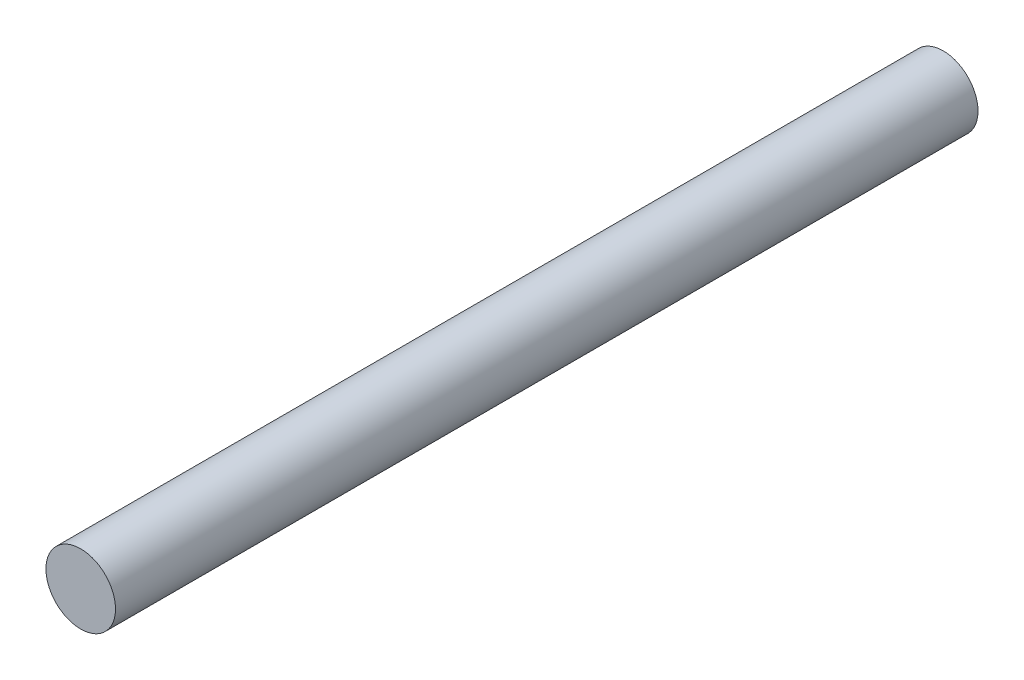
ISO-10303-21;
HEADER;
FILE_DESCRIPTION(('STEP AP214'),'2;1');
FILE_NAME('part.step','',(''),(''),'','','');
FILE_SCHEMA(('AUTOMOTIVE_DESIGN { 1 0 10303 214 1 1 1 1 }'));
ENDSEC;
DATA;
#1=APPLICATION_CONTEXT('core data for automotive mechanical design processes');
#2=APPLICATION_PROTOCOL_DEFINITION('international standard','automotive_design',2000,#1);
#3=PRODUCT_CONTEXT('',#1,'mechanical');
#4=PRODUCT('Part','Part','',(#3));
#5=PRODUCT_RELATED_PRODUCT_CATEGORY('part','',(#4));
#6=PRODUCT_DEFINITION_FORMATION('','',#4);
#7=PRODUCT_DEFINITION_CONTEXT('part definition',#1,'design');
#8=PRODUCT_DEFINITION('design','',#6,#7);
#9=PRODUCT_DEFINITION_SHAPE('','',#8);
#10=(LENGTH_UNIT() NAMED_UNIT(*) SI_UNIT(.MILLI.,.METRE.));
#11=(NAMED_UNIT(*) PLANE_ANGLE_UNIT() SI_UNIT($,.RADIAN.));
#12=(NAMED_UNIT(*) SI_UNIT($,.STERADIAN.) SOLID_ANGLE_UNIT());
#13=UNCERTAINTY_MEASURE_WITH_UNIT(LENGTH_MEASURE(1.E-05),#10,'distance_accuracy_value','');
#14=(GEOMETRIC_REPRESENTATION_CONTEXT(3) GLOBAL_UNCERTAINTY_ASSIGNED_CONTEXT((#13)) GLOBAL_UNIT_ASSIGNED_CONTEXT((#10,
#11,#12)) REPRESENTATION_CONTEXT('',''));
#15=CARTESIAN_POINT('',(0.,0.,0.));
#16=DIRECTION('',(0.,0.,1.));
#17=DIRECTION('',(1.,0.,0.));
#18=AXIS2_PLACEMENT_3D('',#15,#16,#17);
#19=CARTESIAN_POINT('',(0.,0.,62.));
#20=DIRECTION('',(0.,0.,-1.));
#21=DIRECTION('',(-1.,0.,0.));
#22=AXIS2_PLACEMENT_3D('',#19,#20,#21);
#23=CYLINDRICAL_SURFACE('',#22,2.5);
#24=CARTESIAN_POINT('',(0.,0.,62.));
#25=DIRECTION('',(0.,0.,1.));
#26=DIRECTION('',(1.,0.,0.));
#27=AXIS2_PLACEMENT_3D('',#24,#25,#26);
#28=CIRCLE('',#27,2.5);
#29=CARTESIAN_POINT('',(2.5,0.,62.));
#30=VERTEX_POINT('',#29);
#31=EDGE_CURVE('E10',#30,#30,#28,.T.);
#32=ORIENTED_EDGE('',*,*,#31,.F.);
#33=EDGE_LOOP('',(#32));
#34=FACE_BOUND('',#33,.T.);
#35=CARTESIAN_POINT('',(0.,0.,0.));
#36=DIRECTION('',(0.,0.,1.));
#37=DIRECTION('',(1.,0.,0.));
#38=AXIS2_PLACEMENT_3D('',#35,#36,#37);
#39=CIRCLE('',#38,2.5);
#40=CARTESIAN_POINT('',(2.5,0.,0.));
#41=VERTEX_POINT('',#40);
#42=EDGE_CURVE('E35',#41,#41,#39,.T.);
#43=ORIENTED_EDGE('',*,*,#42,.T.);
#44=EDGE_LOOP('',(#43));
#45=FACE_BOUND('',#44,.T.);
#46=ADVANCED_FACE('F32',(#34,#45),#23,.T.);
#47=CARTESIAN_POINT('',(0.,0.,62.));
#48=DIRECTION('',(0.,0.,1.));
#49=DIRECTION('',(1.,0.,0.));
#50=AXIS2_PLACEMENT_3D('',#47,#48,#49);
#51=PLANE('',#50);
#52=ORIENTED_EDGE('',*,*,#31,.T.);
#53=EDGE_LOOP('',(#52));
#54=FACE_BOUND('',#53,.T.);
#55=ADVANCED_FACE('F47',(#54),#51,.T.);
#56=CARTESIAN_POINT('',(0.,0.,0.));
#57=DIRECTION('',(0.,0.,1.));
#58=DIRECTION('',(1.,0.,0.));
#59=AXIS2_PLACEMENT_3D('',#56,#57,#58);
#60=PLANE('',#59);
#61=ORIENTED_EDGE('',*,*,#42,.F.);
#62=EDGE_LOOP('',(#61));
#63=FACE_BOUND('',#62,.T.);
#64=ADVANCED_FACE('F45',(#63),#60,.F.);
#65=CLOSED_SHELL('',(#46,#55,#64));
#66=MANIFOLD_SOLID_BREP('B2',#65);
#67=ADVANCED_BREP_SHAPE_REPRESENTATION('',(#18,#66),#14);
#68=SHAPE_DEFINITION_REPRESENTATION(#9,#67);
ENDSEC;
END-ISO-10303-21;
